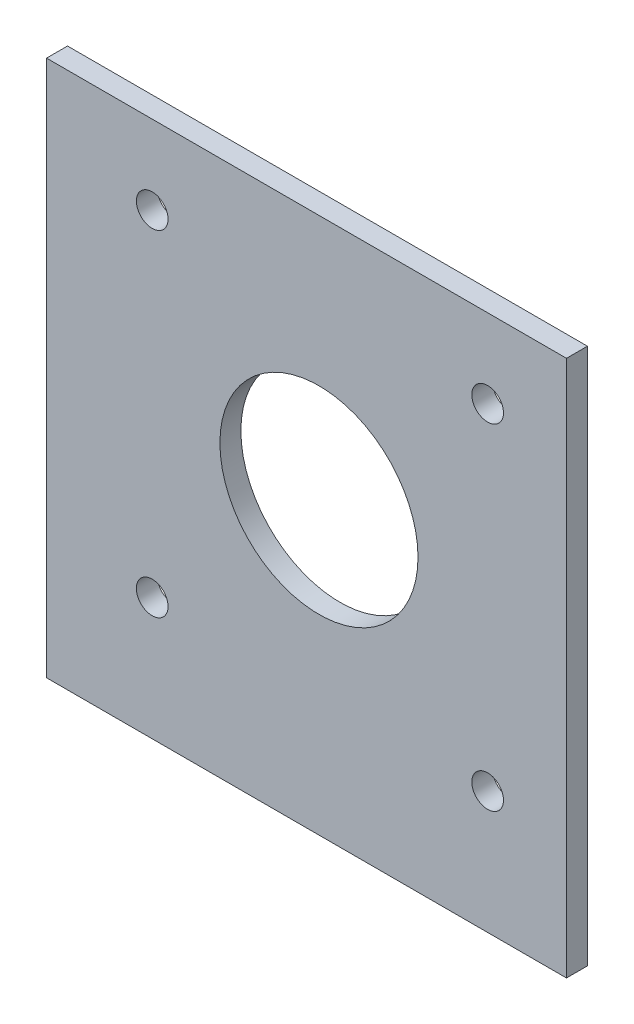
ISO-10303-21;
HEADER;
FILE_DESCRIPTION(('STEP AP214'),'2;1');
FILE_NAME('part.step','',(''),(''),'','','');
FILE_SCHEMA(('AUTOMOTIVE_DESIGN { 1 0 10303 214 1 1 1 1 }'));
ENDSEC;
DATA;
#1=APPLICATION_CONTEXT('core data for automotive mechanical design processes');
#2=APPLICATION_PROTOCOL_DEFINITION('international standard','automotive_design',2000,#1);
#3=PRODUCT_CONTEXT('',#1,'mechanical');
#4=PRODUCT('Part','Part','',(#3));
#5=PRODUCT_RELATED_PRODUCT_CATEGORY('part','',(#4));
#6=PRODUCT_DEFINITION_FORMATION('','',#4);
#7=PRODUCT_DEFINITION_CONTEXT('part definition',#1,'design');
#8=PRODUCT_DEFINITION('design','',#6,#7);
#9=PRODUCT_DEFINITION_SHAPE('','',#8);
#10=(LENGTH_UNIT() NAMED_UNIT(*) SI_UNIT(.MILLI.,.METRE.));
#11=(NAMED_UNIT(*) PLANE_ANGLE_UNIT() SI_UNIT($,.RADIAN.));
#12=(NAMED_UNIT(*) SI_UNIT($,.STERADIAN.) SOLID_ANGLE_UNIT());
#13=UNCERTAINTY_MEASURE_WITH_UNIT(LENGTH_MEASURE(1.E-05),#10,'distance_accuracy_value','');
#14=(GEOMETRIC_REPRESENTATION_CONTEXT(3) GLOBAL_UNCERTAINTY_ASSIGNED_CONTEXT((#13)) GLOBAL_UNIT_ASSIGNED_CONTEXT((#10,
#11,#12)) REPRESENTATION_CONTEXT('',''));
#15=CARTESIAN_POINT('',(0.,0.,0.));
#16=DIRECTION('',(0.,0.,1.));
#17=DIRECTION('',(1.,0.,0.));
#18=AXIS2_PLACEMENT_3D('',#15,#16,#17);
#19=CARTESIAN_POINT('',(-34.29,-38.1,1.5875));
#20=DIRECTION('',(0.,1.,0.));
#21=DIRECTION('',(0.,0.,1.));
#22=AXIS2_PLACEMENT_3D('',#19,#20,#21);
#23=PLANE('',#22);
#24=DIRECTION('',(1.,0.,0.));
#25=VECTOR('',#24,1.);
#26=CARTESIAN_POINT('',(-34.29,-38.1,-1.5875));
#27=LINE('',#26,#25);
#28=CARTESIAN_POINT('',(-39.37,-38.1,-1.5875));
#29=VERTEX_POINT('',#28);
#30=CARTESIAN_POINT('',(39.37,-38.1,-1.5875));
#31=VERTEX_POINT('',#30);
#32=EDGE_CURVE('E40',#29,#31,#27,.T.);
#33=ORIENTED_EDGE('',*,*,#32,.T.);
#34=DIRECTION('',(0.,0.,-1.));
#35=VECTOR('',#34,1.);
#36=CARTESIAN_POINT('',(39.37,-38.1,1.5875));
#37=LINE('',#36,#35);
#38=CARTESIAN_POINT('',(39.37,-38.1,1.5875));
#39=VERTEX_POINT('',#38);
#40=EDGE_CURVE('E107',#39,#31,#37,.T.);
#41=ORIENTED_EDGE('',*,*,#40,.F.);
#42=DIRECTION('',(1.,0.,0.));
#43=VECTOR('',#42,1.);
#44=CARTESIAN_POINT('',(-34.29,-38.1,1.5875));
#45=LINE('',#44,#43);
#46=CARTESIAN_POINT('',(-39.37,-38.1,1.5875));
#47=VERTEX_POINT('',#46);
#48=EDGE_CURVE('E11',#47,#39,#45,.T.);
#49=ORIENTED_EDGE('',*,*,#48,.F.);
#50=DIRECTION('',(0.,0.,-1.));
#51=VECTOR('',#50,1.);
#52=CARTESIAN_POINT('',(-39.37,-38.1,1.5875));
#53=LINE('',#52,#51);
#54=EDGE_CURVE('E97',#47,#29,#53,.T.);
#55=ORIENTED_EDGE('',*,*,#54,.T.);
#56=EDGE_LOOP('',(#33,#41,#49,#55));
#57=FACE_BOUND('',#56,.T.);
#58=ADVANCED_FACE('F37',(#57),#23,.F.);
#59=CARTESIAN_POINT('',(0.,0.,1.5875));
#60=DIRECTION('',(0.,0.,1.));
#61=DIRECTION('',(1.,0.,0.));
#62=AXIS2_PLACEMENT_3D('',#59,#60,#61);
#63=PLANE('',#62);
#64=DIRECTION('',(0.,1.,0.));
#65=VECTOR('',#64,1.);
#66=CARTESIAN_POINT('',(-39.37,0.,1.5875));
#67=LINE('',#66,#65);
#68=CARTESIAN_POINT('',(-39.37,43.18,1.5875));
#69=VERTEX_POINT('',#68);
#70=EDGE_CURVE('E83',#47,#69,#67,.T.);
#71=ORIENTED_EDGE('',*,*,#70,.F.);
#72=ORIENTED_EDGE('',*,*,#48,.T.);
#73=DIRECTION('',(0.,1.,0.));
#74=VECTOR('',#73,1.);
#75=CARTESIAN_POINT('',(39.37,0.,1.5875));
#76=LINE('',#75,#74);
#77=CARTESIAN_POINT('',(39.37,43.18,1.5875));
#78=VERTEX_POINT('',#77);
#79=EDGE_CURVE('E85',#39,#78,#76,.T.);
#80=ORIENTED_EDGE('',*,*,#79,.T.);
#81=DIRECTION('',(-1.,0.,0.));
#82=VECTOR('',#81,1.);
#83=CARTESIAN_POINT('',(0.,43.18,1.5875));
#84=LINE('',#83,#82);
#85=EDGE_CURVE('E78',#78,#69,#84,.T.);
#86=ORIENTED_EDGE('',*,*,#85,.T.);
#87=EDGE_LOOP('',(#71,#72,#80,#86));
#88=FACE_BOUND('',#87,.T.);
#89=CARTESIAN_POINT('',(1.88399999999987,5.84200000000045,1.5875));
#90=DIRECTION('',(0.,0.,1.));
#91=DIRECTION('',(1.,0.,0.));
#92=AXIS2_PLACEMENT_3D('',#89,#90,#91);
#93=CIRCLE('',#92,15.);
#94=CARTESIAN_POINT('',(16.8839999999999,5.84200000000045,1.5875));
#95=VERTEX_POINT('',#94);
#96=EDGE_CURVE('E109',#95,#95,#93,.T.);
#97=ORIENTED_EDGE('',*,*,#96,.F.);
#98=EDGE_LOOP('',(#97));
#99=FACE_BOUND('',#98,.T.);
#100=CARTESIAN_POINT('',(-23.3680000000002,-19.5579999999994,1.5875));
#101=DIRECTION('',(0.,0.,1.));
#102=DIRECTION('',(1.,0.,0.));
#103=AXIS2_PLACEMENT_3D('',#100,#101,#102);
#104=CIRCLE('',#103,2.39999999999999);
#105=CARTESIAN_POINT('',(-20.9680000000002,-19.5579999999994,1.5875));
#106=VERTEX_POINT('',#105);
#107=EDGE_CURVE('E115',#106,#106,#104,.T.);
#108=ORIENTED_EDGE('',*,*,#107,.F.);
#109=EDGE_LOOP('',(#108));
#110=FACE_BOUND('',#109,.T.);
#111=CARTESIAN_POINT('',(-23.3680000000001,31.2420000000004,1.5875));
#112=DIRECTION('',(0.,0.,1.));
#113=DIRECTION('',(1.,0.,0.));
#114=AXIS2_PLACEMENT_3D('',#111,#112,#113);
#115=CIRCLE('',#114,2.39999999999999);
#116=CARTESIAN_POINT('',(-20.9680000000001,31.2420000000004,1.5875));
#117=VERTEX_POINT('',#116);
#118=EDGE_CURVE('E123',#117,#117,#115,.T.);
#119=ORIENTED_EDGE('',*,*,#118,.F.);
#120=EDGE_LOOP('',(#119));
#121=FACE_BOUND('',#120,.T.);
#122=CARTESIAN_POINT('',(27.4319999999998,31.2420000000004,1.5875));
#123=DIRECTION('',(0.,0.,1.));
#124=DIRECTION('',(1.,0.,0.));
#125=AXIS2_PLACEMENT_3D('',#122,#123,#124);
#126=CIRCLE('',#125,2.39999999999999);
#127=CARTESIAN_POINT('',(29.8319999999998,31.2420000000004,1.5875));
#128=VERTEX_POINT('',#127);
#129=EDGE_CURVE('E129',#128,#128,#126,.T.);
#130=ORIENTED_EDGE('',*,*,#129,.F.);
#131=EDGE_LOOP('',(#130));
#132=FACE_BOUND('',#131,.T.);
#133=CARTESIAN_POINT('',(27.4319999999998,-19.5579999999995,1.5875));
#134=DIRECTION('',(0.,0.,1.));
#135=DIRECTION('',(1.,0.,0.));
#136=AXIS2_PLACEMENT_3D('',#133,#134,#135);
#137=CIRCLE('',#136,2.39999999999999);
#138=CARTESIAN_POINT('',(29.8319999999998,-19.5579999999995,1.5875));
#139=VERTEX_POINT('',#138);
#140=EDGE_CURVE('E135',#139,#139,#137,.T.);
#141=ORIENTED_EDGE('',*,*,#140,.F.);
#142=EDGE_LOOP('',(#141));
#143=FACE_BOUND('',#142,.T.);
#144=ADVANCED_FACE('F80',(#88,#99,#110,#121,#132,#143),#63,.T.);
#145=CARTESIAN_POINT('',(0.,0.,-1.5875));
#146=DIRECTION('',(0.,0.,1.));
#147=DIRECTION('',(1.,0.,0.));
#148=AXIS2_PLACEMENT_3D('',#145,#146,#147);
#149=PLANE('',#148);
#150=ORIENTED_EDGE('',*,*,#32,.F.);
#151=DIRECTION('',(0.,1.,0.));
#152=VECTOR('',#151,1.);
#153=CARTESIAN_POINT('',(-39.37,0.,-1.5875));
#154=LINE('',#153,#152);
#155=CARTESIAN_POINT('',(-39.37,43.18,-1.5875));
#156=VERTEX_POINT('',#155);
#157=EDGE_CURVE('E104',#29,#156,#154,.T.);
#158=ORIENTED_EDGE('',*,*,#157,.T.);
#159=DIRECTION('',(-1.,0.,0.));
#160=VECTOR('',#159,1.);
#161=CARTESIAN_POINT('',(0.,43.18,-1.5875));
#162=LINE('',#161,#160);
#163=CARTESIAN_POINT('',(39.37,43.18,-1.5875));
#164=VERTEX_POINT('',#163);
#165=EDGE_CURVE('E92',#164,#156,#162,.T.);
#166=ORIENTED_EDGE('',*,*,#165,.F.);
#167=DIRECTION('',(0.,1.,0.));
#168=VECTOR('',#167,1.);
#169=CARTESIAN_POINT('',(39.37,0.,-1.5875));
#170=LINE('',#169,#168);
#171=EDGE_CURVE('E68',#31,#164,#170,.T.);
#172=ORIENTED_EDGE('',*,*,#171,.F.);
#173=EDGE_LOOP('',(#150,#158,#166,#172));
#174=FACE_BOUND('',#173,.T.);
#175=CARTESIAN_POINT('',(1.88399999999987,5.84200000000045,-1.5875));
#176=DIRECTION('',(0.,0.,1.));
#177=DIRECTION('',(1.,0.,0.));
#178=AXIS2_PLACEMENT_3D('',#175,#176,#177);
#179=CIRCLE('',#178,15.);
#180=CARTESIAN_POINT('',(16.8839999999999,5.84200000000045,-1.5875));
#181=VERTEX_POINT('',#180);
#182=EDGE_CURVE('E112',#181,#181,#179,.T.);
#183=ORIENTED_EDGE('',*,*,#182,.T.);
#184=EDGE_LOOP('',(#183));
#185=FACE_BOUND('',#184,.T.);
#186=CARTESIAN_POINT('',(-23.3680000000002,-19.5579999999994,-1.5875));
#187=DIRECTION('',(0.,0.,1.));
#188=DIRECTION('',(1.,0.,0.));
#189=AXIS2_PLACEMENT_3D('',#186,#187,#188);
#190=CIRCLE('',#189,2.39999999999999);
#191=CARTESIAN_POINT('',(-20.9680000000002,-19.5579999999994,-1.5875));
#192=VERTEX_POINT('',#191);
#193=EDGE_CURVE('E120',#192,#192,#190,.T.);
#194=ORIENTED_EDGE('',*,*,#193,.T.);
#195=EDGE_LOOP('',(#194));
#196=FACE_BOUND('',#195,.T.);
#197=CARTESIAN_POINT('',(-23.3680000000001,31.2420000000004,-1.5875));
#198=DIRECTION('',(0.,0.,1.));
#199=DIRECTION('',(1.,0.,0.));
#200=AXIS2_PLACEMENT_3D('',#197,#198,#199);
#201=CIRCLE('',#200,2.39999999999999);
#202=CARTESIAN_POINT('',(-20.9680000000001,31.2420000000004,-1.5875));
#203=VERTEX_POINT('',#202);
#204=EDGE_CURVE('E126',#203,#203,#201,.T.);
#205=ORIENTED_EDGE('',*,*,#204,.T.);
#206=EDGE_LOOP('',(#205));
#207=FACE_BOUND('',#206,.T.);
#208=CARTESIAN_POINT('',(27.4319999999998,31.2420000000004,-1.5875));
#209=DIRECTION('',(0.,0.,1.));
#210=DIRECTION('',(1.,0.,0.));
#211=AXIS2_PLACEMENT_3D('',#208,#209,#210);
#212=CIRCLE('',#211,2.39999999999999);
#213=CARTESIAN_POINT('',(29.8319999999998,31.2420000000004,-1.5875));
#214=VERTEX_POINT('',#213);
#215=EDGE_CURVE('E132',#214,#214,#212,.T.);
#216=ORIENTED_EDGE('',*,*,#215,.T.);
#217=EDGE_LOOP('',(#216));
#218=FACE_BOUND('',#217,.T.);
#219=CARTESIAN_POINT('',(27.4319999999998,-19.5579999999995,-1.5875));
#220=DIRECTION('',(0.,0.,1.));
#221=DIRECTION('',(1.,0.,0.));
#222=AXIS2_PLACEMENT_3D('',#219,#220,#221);
#223=CIRCLE('',#222,2.39999999999999);
#224=CARTESIAN_POINT('',(29.8319999999998,-19.5579999999995,-1.5875));
#225=VERTEX_POINT('',#224);
#226=EDGE_CURVE('E138',#225,#225,#223,.T.);
#227=ORIENTED_EDGE('',*,*,#226,.T.);
#228=EDGE_LOOP('',(#227));
#229=FACE_BOUND('',#228,.T.);
#230=ADVANCED_FACE('F142',(#174,#185,#196,#207,#218,#229),#149,.F.);
#231=CARTESIAN_POINT('',(27.4319999999998,-19.5579999999995,1.5875));
#232=DIRECTION('',(0.,0.,1.));
#233=DIRECTION('',(1.,0.,0.));
#234=AXIS2_PLACEMENT_3D('',#231,#232,#233);
#235=CYLINDRICAL_SURFACE('',#234,2.39999999999999);
#236=ORIENTED_EDGE('',*,*,#226,.F.);
#237=EDGE_LOOP('',(#236));
#238=FACE_BOUND('',#237,.T.);
#239=ORIENTED_EDGE('',*,*,#140,.T.);
#240=EDGE_LOOP('',(#239));
#241=FACE_BOUND('',#240,.T.);
#242=ADVANCED_FACE('F144',(#238,#241),#235,.F.);
#243=CARTESIAN_POINT('',(27.4319999999998,31.2420000000004,1.5875));
#244=DIRECTION('',(0.,0.,1.));
#245=DIRECTION('',(1.,0.,0.));
#246=AXIS2_PLACEMENT_3D('',#243,#244,#245);
#247=CYLINDRICAL_SURFACE('',#246,2.39999999999999);
#248=ORIENTED_EDGE('',*,*,#215,.F.);
#249=EDGE_LOOP('',(#248));
#250=FACE_BOUND('',#249,.T.);
#251=ORIENTED_EDGE('',*,*,#129,.T.);
#252=EDGE_LOOP('',(#251));
#253=FACE_BOUND('',#252,.T.);
#254=ADVANCED_FACE('F147',(#250,#253),#247,.F.);
#255=CARTESIAN_POINT('',(-23.3680000000001,31.2420000000004,1.5875));
#256=DIRECTION('',(0.,0.,1.));
#257=DIRECTION('',(1.,0.,0.));
#258=AXIS2_PLACEMENT_3D('',#255,#256,#257);
#259=CYLINDRICAL_SURFACE('',#258,2.39999999999999);
#260=ORIENTED_EDGE('',*,*,#204,.F.);
#261=EDGE_LOOP('',(#260));
#262=FACE_BOUND('',#261,.T.);
#263=ORIENTED_EDGE('',*,*,#118,.T.);
#264=EDGE_LOOP('',(#263));
#265=FACE_BOUND('',#264,.T.);
#266=ADVANCED_FACE('F161',(#262,#265),#259,.F.);
#267=CARTESIAN_POINT('',(-23.3680000000002,-19.5579999999994,1.5875));
#268=DIRECTION('',(0.,0.,1.));
#269=DIRECTION('',(1.,0.,0.));
#270=AXIS2_PLACEMENT_3D('',#267,#268,#269);
#271=CYLINDRICAL_SURFACE('',#270,2.39999999999999);
#272=ORIENTED_EDGE('',*,*,#193,.F.);
#273=EDGE_LOOP('',(#272));
#274=FACE_BOUND('',#273,.T.);
#275=ORIENTED_EDGE('',*,*,#107,.T.);
#276=EDGE_LOOP('',(#275));
#277=FACE_BOUND('',#276,.T.);
#278=ADVANCED_FACE('F165',(#274,#277),#271,.F.);
#279=CARTESIAN_POINT('',(1.88399999999987,5.84200000000045,-1.5875));
#280=DIRECTION('',(0.,0.,1.));
#281=DIRECTION('',(1.,0.,0.));
#282=AXIS2_PLACEMENT_3D('',#279,#280,#281);
#283=CYLINDRICAL_SURFACE('',#282,15.);
#284=ORIENTED_EDGE('',*,*,#182,.F.);
#285=EDGE_LOOP('',(#284));
#286=FACE_BOUND('',#285,.T.);
#287=ORIENTED_EDGE('',*,*,#96,.T.);
#288=EDGE_LOOP('',(#287));
#289=FACE_BOUND('',#288,.T.);
#290=ADVANCED_FACE('F169',(#286,#289),#283,.F.);
#291=CARTESIAN_POINT('',(39.37,0.,1.5875));
#292=DIRECTION('',(-1.,0.,0.));
#293=DIRECTION('',(0.,0.,1.));
#294=AXIS2_PLACEMENT_3D('',#291,#292,#293);
#295=PLANE('',#294);
#296=ORIENTED_EDGE('',*,*,#171,.T.);
#297=DIRECTION('',(0.,0.,-1.));
#298=VECTOR('',#297,1.);
#299=CARTESIAN_POINT('',(39.37,43.18,1.5875));
#300=LINE('',#299,#298);
#301=EDGE_CURVE('E96',#78,#164,#300,.T.);
#302=ORIENTED_EDGE('',*,*,#301,.F.);
#303=ORIENTED_EDGE('',*,*,#79,.F.);
#304=ORIENTED_EDGE('',*,*,#40,.T.);
#305=EDGE_LOOP('',(#296,#302,#303,#304));
#306=FACE_BOUND('',#305,.T.);
#307=ADVANCED_FACE('F173',(#306),#295,.F.);
#308=CARTESIAN_POINT('',(0.,43.18,1.5875));
#309=DIRECTION('',(0.,-1.,0.));
#310=DIRECTION('',(0.,0.,-1.));
#311=AXIS2_PLACEMENT_3D('',#308,#309,#310);
#312=PLANE('',#311);
#313=ORIENTED_EDGE('',*,*,#165,.T.);
#314=DIRECTION('',(0.,0.,-1.));
#315=VECTOR('',#314,1.);
#316=CARTESIAN_POINT('',(-39.37,43.18,1.5875));
#317=LINE('',#316,#315);
#318=EDGE_CURVE('E89',#69,#156,#317,.T.);
#319=ORIENTED_EDGE('',*,*,#318,.F.);
#320=ORIENTED_EDGE('',*,*,#85,.F.);
#321=ORIENTED_EDGE('',*,*,#301,.T.);
#322=EDGE_LOOP('',(#313,#319,#320,#321));
#323=FACE_BOUND('',#322,.T.);
#324=ADVANCED_FACE('F90',(#323),#312,.F.);
#325=CARTESIAN_POINT('',(-39.37,0.,1.5875));
#326=DIRECTION('',(-1.,0.,0.));
#327=DIRECTION('',(0.,0.,1.));
#328=AXIS2_PLACEMENT_3D('',#325,#326,#327);
#329=PLANE('',#328);
#330=ORIENTED_EDGE('',*,*,#157,.F.);
#331=ORIENTED_EDGE('',*,*,#54,.F.);
#332=ORIENTED_EDGE('',*,*,#70,.T.);
#333=ORIENTED_EDGE('',*,*,#318,.T.);
#334=EDGE_LOOP('',(#330,#331,#332,#333));
#335=FACE_BOUND('',#334,.T.);
#336=ADVANCED_FACE('F99',(#335),#329,.T.);
#337=CLOSED_SHELL('',(#58,#144,#230,#242,#254,#266,#278,#290,#307,#324,#336));
#338=MANIFOLD_SOLID_BREP('B2',#337);
#339=ADVANCED_BREP_SHAPE_REPRESENTATION('',(#18,#338),#14);
#340=SHAPE_DEFINITION_REPRESENTATION(#9,#339);
ENDSEC;
END-ISO-10303-21;
